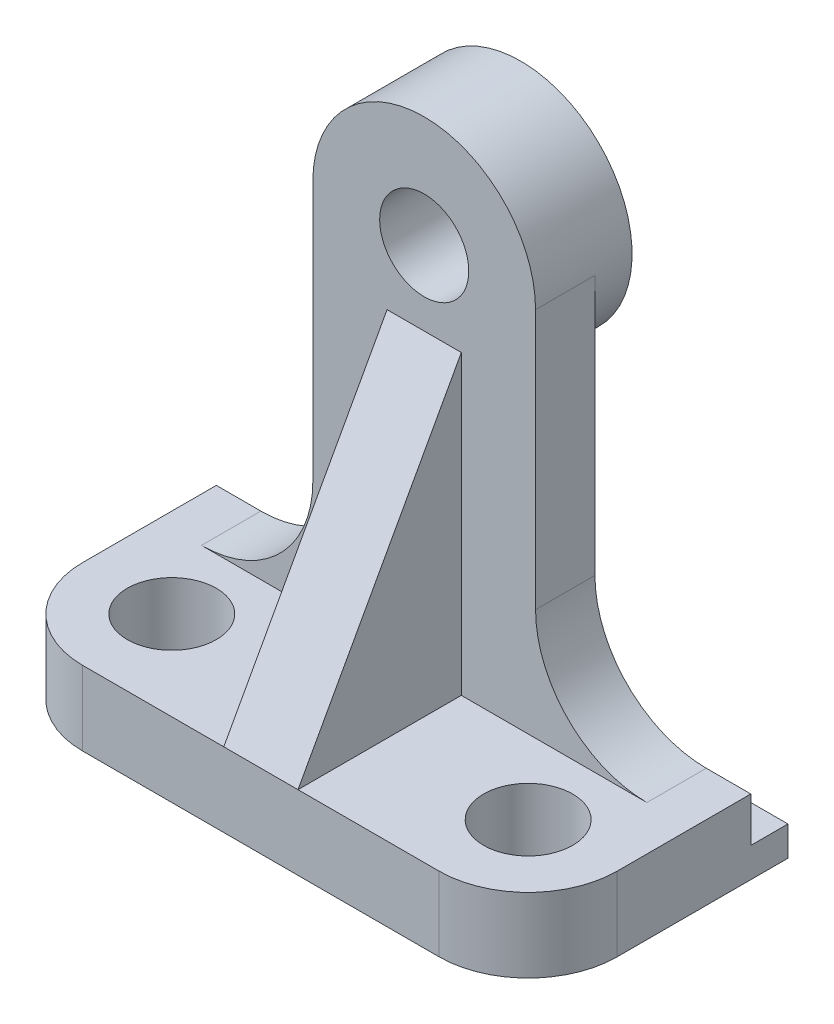
ISO-10303-21;
HEADER;
FILE_DESCRIPTION(('STEP AP214'),'2;1');
FILE_NAME('part.step','',(''),(''),'','','');
FILE_SCHEMA(('AUTOMOTIVE_DESIGN { 1 0 10303 214 1 1 1 1 }'));
ENDSEC;
DATA;
#1=APPLICATION_CONTEXT('core data for automotive mechanical design processes');
#2=APPLICATION_PROTOCOL_DEFINITION('international standard','automotive_design',2000,#1);
#3=PRODUCT_CONTEXT('',#1,'mechanical');
#4=PRODUCT('Part','Part','',(#3));
#5=PRODUCT_RELATED_PRODUCT_CATEGORY('part','',(#4));
#6=PRODUCT_DEFINITION_FORMATION('','',#4);
#7=PRODUCT_DEFINITION_CONTEXT('part definition',#1,'design');
#8=PRODUCT_DEFINITION('design','',#6,#7);
#9=PRODUCT_DEFINITION_SHAPE('','',#8);
#10=(LENGTH_UNIT() NAMED_UNIT(*) SI_UNIT(.MILLI.,.METRE.));
#11=(NAMED_UNIT(*) PLANE_ANGLE_UNIT() SI_UNIT($,.RADIAN.));
#12=(NAMED_UNIT(*) SI_UNIT($,.STERADIAN.) SOLID_ANGLE_UNIT());
#13=UNCERTAINTY_MEASURE_WITH_UNIT(LENGTH_MEASURE(1.E-05),#10,'distance_accuracy_value','');
#14=(GEOMETRIC_REPRESENTATION_CONTEXT(3) GLOBAL_UNCERTAINTY_ASSIGNED_CONTEXT((#13)) GLOBAL_UNIT_ASSIGNED_CONTEXT((#10,
#11,#12)) REPRESENTATION_CONTEXT('',''));
#15=CARTESIAN_POINT('',(0.,0.,0.));
#16=DIRECTION('',(0.,0.,1.));
#17=DIRECTION('',(1.,0.,0.));
#18=AXIS2_PLACEMENT_3D('',#15,#16,#17);
#19=CARTESIAN_POINT('',(0.,10.,0.));
#20=DIRECTION('',(0.,1.,0.));
#21=DIRECTION('',(0.,0.,1.));
#22=AXIS2_PLACEMENT_3D('',#19,#20,#21);
#23=PLANE('',#22);
#24=CARTESIAN_POINT('',(-24.,10.,5.5));
#25=DIRECTION('',(0.,1.,0.));
#26=DIRECTION('',(0.,0.,1.));
#27=AXIS2_PLACEMENT_3D('',#24,#25,#26);
#28=CIRCLE('',#27,6.);
#29=CARTESIAN_POINT('',(-24.,10.,11.5));
#30=VERTEX_POINT('',#29);
#31=EDGE_CURVE('E331',#30,#30,#28,.F.);
#32=ORIENTED_EDGE('',*,*,#31,.T.);
#33=EDGE_LOOP('',(#32));
#34=FACE_BOUND('',#33,.T.);
#35=DIRECTION('',(1.,0.,0.));
#36=VECTOR('',#35,1.);
#37=CARTESIAN_POINT('',(0.,10.,17.5));
#38=LINE('',#37,#36);
#39=CARTESIAN_POINT('',(-24.,10.,17.5));
#40=VERTEX_POINT('',#39);
#41=CARTESIAN_POINT('',(-5.,10.,17.5));
#42=VERTEX_POINT('',#41);
#43=EDGE_CURVE('E176',#40,#42,#38,.T.);
#44=ORIENTED_EDGE('',*,*,#43,.T.);
#45=DIRECTION('',(0.,0.,-1.));
#46=VECTOR('',#45,1.);
#47=CARTESIAN_POINT('',(-5.,10.,0.));
#48=LINE('',#47,#46);
#49=CARTESIAN_POINT('',(-5.,10.,-4.5));
#50=VERTEX_POINT('',#49);
#51=EDGE_CURVE('E155',#42,#50,#48,.T.);
#52=ORIENTED_EDGE('',*,*,#51,.T.);
#53=DIRECTION('',(1.,0.,0.));
#54=VECTOR('',#53,1.);
#55=CARTESIAN_POINT('',(-30.0000000000001,10.,-4.5));
#56=LINE('',#55,#54);
#57=CARTESIAN_POINT('',(-30.0000000000001,10.,-4.5));
#58=VERTEX_POINT('',#57);
#59=EDGE_CURVE('E61',#58,#50,#56,.T.);
#60=ORIENTED_EDGE('',*,*,#59,.F.);
#61=DIRECTION('',(0.,0.,-1.));
#62=VECTOR('',#61,1.);
#63=CARTESIAN_POINT('',(-30.0000000000001,10.,-4.5));
#64=LINE('',#63,#62);
#65=CARTESIAN_POINT('',(-30.,10.,-12.5));
#66=VERTEX_POINT('',#65);
#67=EDGE_CURVE('E322',#58,#66,#64,.T.);
#68=ORIENTED_EDGE('',*,*,#67,.T.);
#69=DIRECTION('',(-1.,0.,0.));
#70=VECTOR('',#69,1.);
#71=CARTESIAN_POINT('',(0.,10.,-12.5));
#72=LINE('',#71,#70);
#73=CARTESIAN_POINT('',(-36.,10.,-12.5));
#74=VERTEX_POINT('',#73);
#75=EDGE_CURVE('E335',#66,#74,#72,.T.);
#76=ORIENTED_EDGE('',*,*,#75,.T.);
#77=DIRECTION('',(0.,0.,1.));
#78=VECTOR('',#77,1.);
#79=CARTESIAN_POINT('',(-36.,10.,0.));
#80=LINE('',#79,#78);
#81=CARTESIAN_POINT('',(-36.,10.,5.49999999999992));
#82=VERTEX_POINT('',#81);
#83=EDGE_CURVE('E337',#74,#82,#80,.T.);
#84=ORIENTED_EDGE('',*,*,#83,.T.);
#85=CARTESIAN_POINT('',(-24.,10.,5.5));
#86=DIRECTION('',(0.,1.,0.));
#87=DIRECTION('',(0.,0.,1.));
#88=AXIS2_PLACEMENT_3D('',#85,#86,#87);
#89=CIRCLE('',#88,12.);
#90=EDGE_CURVE('E184',#82,#40,#89,.T.);
#91=ORIENTED_EDGE('',*,*,#90,.T.);
#92=EDGE_LOOP('',(#44,#52,#60,#68,#76,#84,#91));
#93=FACE_BOUND('',#92,.T.);
#94=ADVANCED_FACE('F38',(#34,#93),#23,.T.);
#95=CARTESIAN_POINT('',(0.,10.,-12.5));
#96=DIRECTION('',(0.,0.,1.));
#97=DIRECTION('',(1.,0.,0.));
#98=AXIS2_PLACEMENT_3D('',#95,#96,#97);
#99=PLANE('',#98);
#100=DIRECTION('',(-1.,0.,0.));
#101=VECTOR('',#100,1.);
#102=CARTESIAN_POINT('',(0.,4.,-12.5));
#103=LINE('',#102,#101);
#104=CARTESIAN_POINT('',(36.,4.,-12.5));
#105=VERTEX_POINT('',#104);
#106=CARTESIAN_POINT('',(-36.,4.,-12.5));
#107=VERTEX_POINT('',#106);
#108=EDGE_CURVE('E193',#105,#107,#103,.T.);
#109=ORIENTED_EDGE('',*,*,#108,.T.);
#110=DIRECTION('',(0.,-1.,0.));
#111=VECTOR('',#110,1.);
#112=CARTESIAN_POINT('',(-36.,10.,-12.5));
#113=LINE('',#112,#111);
#114=EDGE_CURVE('E188',#74,#107,#113,.T.);
#115=ORIENTED_EDGE('',*,*,#114,.F.);
#116=ORIENTED_EDGE('',*,*,#75,.F.);
#117=CARTESIAN_POINT('',(-30.,25.,-12.5));
#118=DIRECTION('',(0.,0.,-1.));
#119=DIRECTION('',(-1.,0.,0.));
#120=AXIS2_PLACEMENT_3D('',#117,#118,#119);
#121=CIRCLE('',#120,15.);
#122=CARTESIAN_POINT('',(-15.,25.0000000000001,-12.5));
#123=VERTEX_POINT('',#122);
#124=EDGE_CURVE('E307',#123,#66,#121,.T.);
#125=ORIENTED_EDGE('',*,*,#124,.F.);
#126=DIRECTION('',(0.,-1.,0.));
#127=VECTOR('',#126,1.);
#128=CARTESIAN_POINT('',(-15.,60.,-12.5));
#129=LINE('',#128,#127);
#130=CARTESIAN_POINT('',(-15.,60.,-12.5));
#131=VERTEX_POINT('',#130);
#132=EDGE_CURVE('E291',#131,#123,#129,.T.);
#133=ORIENTED_EDGE('',*,*,#132,.F.);
#134=CARTESIAN_POINT('',(0.,60.,-12.5));
#135=DIRECTION('',(0.,0.,-1.));
#136=DIRECTION('',(-1.,0.,0.));
#137=AXIS2_PLACEMENT_3D('',#134,#135,#136);
#138=CIRCLE('',#137,15.);
#139=CARTESIAN_POINT('',(15.,60.,-12.5));
#140=VERTEX_POINT('',#139);
#141=EDGE_CURVE('E179',#140,#131,#138,.T.);
#142=ORIENTED_EDGE('',*,*,#141,.F.);
#143=DIRECTION('',(0.,1.,0.));
#144=VECTOR('',#143,1.);
#145=CARTESIAN_POINT('',(15.,60.,-12.5));
#146=LINE('',#145,#144);
#147=CARTESIAN_POINT('',(15.,25.0000000000001,-12.5));
#148=VERTEX_POINT('',#147);
#149=EDGE_CURVE('E296',#148,#140,#146,.T.);
#150=ORIENTED_EDGE('',*,*,#149,.F.);
#151=CARTESIAN_POINT('',(30.,25.,-12.5));
#152=DIRECTION('',(0.,0.,-1.));
#153=DIRECTION('',(1.,0.,0.));
#154=AXIS2_PLACEMENT_3D('',#151,#152,#153);
#155=CIRCLE('',#154,15.);
#156=CARTESIAN_POINT('',(30.0000000000001,10.,-12.5));
#157=VERTEX_POINT('',#156);
#158=EDGE_CURVE('E310',#157,#148,#155,.T.);
#159=ORIENTED_EDGE('',*,*,#158,.F.);
#160=CARTESIAN_POINT('',(36.,10.,-12.5));
#161=VERTEX_POINT('',#160);
#162=EDGE_CURVE('E336',#161,#157,#72,.T.);
#163=ORIENTED_EDGE('',*,*,#162,.F.);
#164=DIRECTION('',(0.,-1.,0.));
#165=VECTOR('',#164,1.);
#166=CARTESIAN_POINT('',(36.,10.,-12.5));
#167=LINE('',#166,#165);
#168=EDGE_CURVE('E199',#161,#105,#167,.T.);
#169=ORIENTED_EDGE('',*,*,#168,.T.);
#170=EDGE_LOOP('',(#109,#115,#116,#125,#133,#142,#150,#159,#163,#169));
#171=FACE_BOUND('',#170,.T.);
#172=ADVANCED_FACE('F342',(#171),#99,.F.);
#173=DIRECTION('',(0.,0.,-1.));
#174=VECTOR('',#173,1.);
#175=CARTESIAN_POINT('',(5.,10.,0.));
#176=LINE('',#175,#174);
#177=CARTESIAN_POINT('',(5.,10.,17.5));
#178=VERTEX_POINT('',#177);
#179=CARTESIAN_POINT('',(5.,10.,-4.5));
#180=VERTEX_POINT('',#179);
#181=EDGE_CURVE('E270',#178,#180,#176,.T.);
#182=ORIENTED_EDGE('',*,*,#181,.F.);
#183=CARTESIAN_POINT('',(24.,10.,17.5));
#184=VERTEX_POINT('',#183);
#185=EDGE_CURVE('E178',#178,#184,#38,.T.);
#186=ORIENTED_EDGE('',*,*,#185,.T.);
#187=CARTESIAN_POINT('',(24.,10.,5.5));
#188=DIRECTION('',(0.,1.,0.));
#189=DIRECTION('',(0.,0.,1.));
#190=AXIS2_PLACEMENT_3D('',#187,#188,#189);
#191=CIRCLE('',#190,12.);
#192=CARTESIAN_POINT('',(36.,10.,5.49999999999992));
#193=VERTEX_POINT('',#192);
#194=EDGE_CURVE('E185',#184,#193,#191,.T.);
#195=ORIENTED_EDGE('',*,*,#194,.T.);
#196=DIRECTION('',(0.,0.,-1.));
#197=VECTOR('',#196,1.);
#198=CARTESIAN_POINT('',(36.,10.,0.));
#199=LINE('',#198,#197);
#200=EDGE_CURVE('E264',#193,#161,#199,.T.);
#201=ORIENTED_EDGE('',*,*,#200,.T.);
#202=ORIENTED_EDGE('',*,*,#162,.T.);
#203=DIRECTION('',(0.,0.,-1.));
#204=VECTOR('',#203,1.);
#205=CARTESIAN_POINT('',(30.0000000000001,10.,-4.5));
#206=LINE('',#205,#204);
#207=CARTESIAN_POINT('',(30.,10.,-4.5));
#208=VERTEX_POINT('',#207);
#209=EDGE_CURVE('E319',#208,#157,#206,.T.);
#210=ORIENTED_EDGE('',*,*,#209,.F.);
#211=EDGE_CURVE('E272',#180,#208,#56,.T.);
#212=ORIENTED_EDGE('',*,*,#211,.F.);
#213=EDGE_LOOP('',(#182,#186,#195,#201,#202,#210,#212));
#214=FACE_BOUND('',#213,.T.);
#215=CARTESIAN_POINT('',(24.,10.,5.5));
#216=DIRECTION('',(0.,1.,0.));
#217=DIRECTION('',(0.,0.,1.));
#218=AXIS2_PLACEMENT_3D('',#215,#216,#217);
#219=CIRCLE('',#218,6.);
#220=CARTESIAN_POINT('',(24.,10.,11.5));
#221=VERTEX_POINT('',#220);
#222=EDGE_CURVE('E195',#221,#221,#219,.F.);
#223=ORIENTED_EDGE('',*,*,#222,.T.);
#224=EDGE_LOOP('',(#223));
#225=FACE_BOUND('',#224,.T.);
#226=ADVANCED_FACE('F267',(#214,#225),#23,.T.);
#227=CARTESIAN_POINT('',(24.,4.,5.5));
#228=DIRECTION('',(0.,-1.,0.));
#229=DIRECTION('',(0.,0.,-1.));
#230=AXIS2_PLACEMENT_3D('',#227,#228,#229);
#231=PLANE('',#230);
#232=DIRECTION('',(-1.,0.,0.));
#233=VECTOR('',#232,1.);
#234=CARTESIAN_POINT('',(-36.,4.,-17.5));
#235=LINE('',#234,#233);
#236=CARTESIAN_POINT('',(36.,4.,-17.5));
#237=VERTEX_POINT('',#236);
#238=CARTESIAN_POINT('',(-36.,4.,-17.5));
#239=VERTEX_POINT('',#238);
#240=EDGE_CURVE('E211',#237,#239,#235,.T.);
#241=ORIENTED_EDGE('',*,*,#240,.T.);
#242=DIRECTION('',(0.,0.,1.));
#243=VECTOR('',#242,1.);
#244=CARTESIAN_POINT('',(-36.,4.,-17.5));
#245=LINE('',#244,#243);
#246=EDGE_CURVE('E214',#239,#107,#245,.T.);
#247=ORIENTED_EDGE('',*,*,#246,.T.);
#248=ORIENTED_EDGE('',*,*,#108,.F.);
#249=DIRECTION('',(0.,0.,-1.));
#250=VECTOR('',#249,1.);
#251=CARTESIAN_POINT('',(36.,4.,-17.5));
#252=LINE('',#251,#250);
#253=EDGE_CURVE('E209',#105,#237,#252,.T.);
#254=ORIENTED_EDGE('',*,*,#253,.T.);
#255=EDGE_LOOP('',(#241,#247,#248,#254));
#256=FACE_BOUND('',#255,.T.);
#257=ADVANCED_FACE('F345',(#256),#231,.F.);
#258=CARTESIAN_POINT('',(24.,0.,5.5));
#259=DIRECTION('',(0.,-1.,0.));
#260=DIRECTION('',(0.,0.,-1.));
#261=AXIS2_PLACEMENT_3D('',#258,#259,#260);
#262=PLANE('',#261);
#263=CARTESIAN_POINT('',(24.,0.,5.5));
#264=DIRECTION('',(0.,1.,0.));
#265=DIRECTION('',(0.,0.,-1.));
#266=AXIS2_PLACEMENT_3D('',#263,#264,#265);
#267=CIRCLE('',#266,12.);
#268=CARTESIAN_POINT('',(23.9999999999999,0.,17.5));
#269=VERTEX_POINT('',#268);
#270=CARTESIAN_POINT('',(36.,0.,5.49999999999992));
#271=VERTEX_POINT('',#270);
#272=EDGE_CURVE('E212',#269,#271,#267,.T.);
#273=ORIENTED_EDGE('',*,*,#272,.F.);
#274=DIRECTION('',(1.,0.,0.));
#275=VECTOR('',#274,1.);
#276=CARTESIAN_POINT('',(23.9999999999999,0.,17.5));
#277=LINE('',#276,#275);
#278=CARTESIAN_POINT('',(-24.,0.,17.5));
#279=VERTEX_POINT('',#278);
#280=EDGE_CURVE('E226',#279,#269,#277,.T.);
#281=ORIENTED_EDGE('',*,*,#280,.F.);
#282=CARTESIAN_POINT('',(-24.,0.,5.5));
#283=DIRECTION('',(0.,1.,0.));
#284=DIRECTION('',(0.,0.,1.));
#285=AXIS2_PLACEMENT_3D('',#282,#283,#284);
#286=CIRCLE('',#285,12.);
#287=CARTESIAN_POINT('',(-36.,0.,5.49999999999992));
#288=VERTEX_POINT('',#287);
#289=EDGE_CURVE('E224',#288,#279,#286,.T.);
#290=ORIENTED_EDGE('',*,*,#289,.F.);
#291=DIRECTION('',(0.,0.,1.));
#292=VECTOR('',#291,1.);
#293=CARTESIAN_POINT('',(-36.,0.,-17.5));
#294=LINE('',#293,#292);
#295=CARTESIAN_POINT('',(-36.,0.,-17.5));
#296=VERTEX_POINT('',#295);
#297=EDGE_CURVE('E222',#296,#288,#294,.T.);
#298=ORIENTED_EDGE('',*,*,#297,.F.);
#299=DIRECTION('',(-1.,0.,0.));
#300=VECTOR('',#299,1.);
#301=CARTESIAN_POINT('',(-36.,0.,-17.5));
#302=LINE('',#301,#300);
#303=CARTESIAN_POINT('',(36.,0.,-17.5));
#304=VERTEX_POINT('',#303);
#305=EDGE_CURVE('E220',#304,#296,#302,.T.);
#306=ORIENTED_EDGE('',*,*,#305,.F.);
#307=DIRECTION('',(0.,0.,-1.));
#308=VECTOR('',#307,1.);
#309=CARTESIAN_POINT('',(36.,0.,-17.5));
#310=LINE('',#309,#308);
#311=EDGE_CURVE('E208',#271,#304,#310,.T.);
#312=ORIENTED_EDGE('',*,*,#311,.F.);
#313=EDGE_LOOP('',(#273,#281,#290,#298,#306,#312));
#314=FACE_BOUND('',#313,.T.);
#315=CARTESIAN_POINT('',(24.,0.,5.5));
#316=DIRECTION('',(0.,1.,0.));
#317=DIRECTION('',(0.,0.,1.));
#318=AXIS2_PLACEMENT_3D('',#315,#316,#317);
#319=CIRCLE('',#318,6.);
#320=CARTESIAN_POINT('',(24.,0.,11.5));
#321=VERTEX_POINT('',#320);
#322=EDGE_CURVE('E205',#321,#321,#319,.T.);
#323=ORIENTED_EDGE('',*,*,#322,.T.);
#324=EDGE_LOOP('',(#323));
#325=FACE_BOUND('',#324,.T.);
#326=CARTESIAN_POINT('',(-24.,0.,5.5));
#327=DIRECTION('',(0.,1.,0.));
#328=DIRECTION('',(0.,0.,-1.));
#329=AXIS2_PLACEMENT_3D('',#326,#327,#328);
#330=CIRCLE('',#329,6.);
#331=CARTESIAN_POINT('',(-24.,0.,-0.5));
#332=VERTEX_POINT('',#331);
#333=EDGE_CURVE('E202',#332,#332,#330,.T.);
#334=ORIENTED_EDGE('',*,*,#333,.T.);
#335=EDGE_LOOP('',(#334));
#336=FACE_BOUND('',#335,.T.);
#337=ADVANCED_FACE('F249',(#314,#325,#336),#262,.T.);
#338=CARTESIAN_POINT('',(36.,4.,-17.5));
#339=DIRECTION('',(-1.,0.,0.));
#340=DIRECTION('',(0.,0.,1.));
#341=AXIS2_PLACEMENT_3D('',#338,#339,#340);
#342=PLANE('',#341);
#343=ORIENTED_EDGE('',*,*,#311,.T.);
#344=DIRECTION('',(0.,-1.,0.));
#345=VECTOR('',#344,1.);
#346=CARTESIAN_POINT('',(36.,4.,-17.5));
#347=LINE('',#346,#345);
#348=EDGE_CURVE('E11',#237,#304,#347,.T.);
#349=ORIENTED_EDGE('',*,*,#348,.F.);
#350=ORIENTED_EDGE('',*,*,#253,.F.);
#351=ORIENTED_EDGE('',*,*,#168,.F.);
#352=ORIENTED_EDGE('',*,*,#200,.F.);
#353=DIRECTION('',(0.,-1.,0.));
#354=VECTOR('',#353,1.);
#355=CARTESIAN_POINT('',(36.,4.,5.49999999999992));
#356=LINE('',#355,#354);
#357=EDGE_CURVE('E217',#193,#271,#356,.T.);
#358=ORIENTED_EDGE('',*,*,#357,.T.);
#359=EDGE_LOOP('',(#343,#349,#350,#351,#352,#358));
#360=FACE_BOUND('',#359,.T.);
#361=ADVANCED_FACE('F40',(#360),#342,.F.);
#362=CARTESIAN_POINT('',(-36.,4.,-17.5));
#363=DIRECTION('',(0.,0.,1.));
#364=DIRECTION('',(1.,0.,0.));
#365=AXIS2_PLACEMENT_3D('',#362,#363,#364);
#366=PLANE('',#365);
#367=ORIENTED_EDGE('',*,*,#305,.T.);
#368=DIRECTION('',(0.,-1.,0.));
#369=VECTOR('',#368,1.);
#370=CARTESIAN_POINT('',(-36.,4.,-17.5));
#371=LINE('',#370,#369);
#372=EDGE_CURVE('E46',#239,#296,#371,.T.);
#373=ORIENTED_EDGE('',*,*,#372,.F.);
#374=ORIENTED_EDGE('',*,*,#240,.F.);
#375=ORIENTED_EDGE('',*,*,#348,.T.);
#376=EDGE_LOOP('',(#367,#373,#374,#375));
#377=FACE_BOUND('',#376,.T.);
#378=ADVANCED_FACE('F346',(#377),#366,.F.);
#379=CARTESIAN_POINT('',(-36.,4.,-17.5));
#380=DIRECTION('',(1.,0.,0.));
#381=DIRECTION('',(0.,0.,-1.));
#382=AXIS2_PLACEMENT_3D('',#379,#380,#381);
#383=PLANE('',#382);
#384=ORIENTED_EDGE('',*,*,#297,.T.);
#385=DIRECTION('',(0.,-1.,0.));
#386=VECTOR('',#385,1.);
#387=CARTESIAN_POINT('',(-36.,4.,5.49999999999992));
#388=LINE('',#387,#386);
#389=EDGE_CURVE('E236',#82,#288,#388,.T.);
#390=ORIENTED_EDGE('',*,*,#389,.F.);
#391=ORIENTED_EDGE('',*,*,#83,.F.);
#392=ORIENTED_EDGE('',*,*,#114,.T.);
#393=ORIENTED_EDGE('',*,*,#246,.F.);
#394=ORIENTED_EDGE('',*,*,#372,.T.);
#395=EDGE_LOOP('',(#384,#390,#391,#392,#393,#394));
#396=FACE_BOUND('',#395,.T.);
#397=ADVANCED_FACE('F243',(#396),#383,.F.);
#398=CARTESIAN_POINT('',(-24.,4.,5.5));
#399=DIRECTION('',(0.,-1.,0.));
#400=DIRECTION('',(0.,0.,-1.));
#401=AXIS2_PLACEMENT_3D('',#398,#399,#400);
#402=CYLINDRICAL_SURFACE('',#401,12.);
#403=ORIENTED_EDGE('',*,*,#289,.T.);
#404=DIRECTION('',(0.,-1.,0.));
#405=VECTOR('',#404,1.);
#406=CARTESIAN_POINT('',(-24.,4.,17.5));
#407=LINE('',#406,#405);
#408=EDGE_CURVE('E234',#40,#279,#407,.T.);
#409=ORIENTED_EDGE('',*,*,#408,.F.);
#410=ORIENTED_EDGE('',*,*,#90,.F.);
#411=ORIENTED_EDGE('',*,*,#389,.T.);
#412=EDGE_LOOP('',(#403,#409,#410,#411));
#413=FACE_BOUND('',#412,.T.);
#414=ADVANCED_FACE('F254',(#413),#402,.T.);
#415=CARTESIAN_POINT('',(23.9999999999999,4.,17.5));
#416=DIRECTION('',(0.,0.,-1.));
#417=DIRECTION('',(-1.,0.,0.));
#418=AXIS2_PLACEMENT_3D('',#415,#416,#417);
#419=PLANE('',#418);
#420=ORIENTED_EDGE('',*,*,#185,.F.);
#421=DIRECTION('',(-1.,0.,0.));
#422=VECTOR('',#421,1.);
#423=CARTESIAN_POINT('',(23.9999999999999,10.,17.5));
#424=LINE('',#423,#422);
#425=EDGE_CURVE('E166',#42,#178,#424,.F.);
#426=ORIENTED_EDGE('',*,*,#425,.F.);
#427=ORIENTED_EDGE('',*,*,#43,.F.);
#428=ORIENTED_EDGE('',*,*,#408,.T.);
#429=ORIENTED_EDGE('',*,*,#280,.T.);
#430=DIRECTION('',(0.,-1.,0.));
#431=VECTOR('',#430,1.);
#432=CARTESIAN_POINT('',(23.9999999999999,4.,17.5));
#433=LINE('',#432,#431);
#434=EDGE_CURVE('E231',#184,#269,#433,.T.);
#435=ORIENTED_EDGE('',*,*,#434,.F.);
#436=EDGE_LOOP('',(#420,#426,#427,#428,#429,#435));
#437=FACE_BOUND('',#436,.T.);
#438=ADVANCED_FACE('F174',(#437),#419,.F.);
#439=CARTESIAN_POINT('',(24.,4.,5.5));
#440=DIRECTION('',(0.,-1.,0.));
#441=DIRECTION('',(0.,0.,-1.));
#442=AXIS2_PLACEMENT_3D('',#439,#440,#441);
#443=CYLINDRICAL_SURFACE('',#442,12.);
#444=ORIENTED_EDGE('',*,*,#272,.T.);
#445=ORIENTED_EDGE('',*,*,#357,.F.);
#446=ORIENTED_EDGE('',*,*,#194,.F.);
#447=ORIENTED_EDGE('',*,*,#434,.T.);
#448=EDGE_LOOP('',(#444,#445,#446,#447));
#449=FACE_BOUND('',#448,.T.);
#450=ADVANCED_FACE('F257',(#449),#443,.T.);
#451=CARTESIAN_POINT('',(24.,4.,5.5));
#452=DIRECTION('',(0.,-1.,0.));
#453=DIRECTION('',(0.,0.,-1.));
#454=AXIS2_PLACEMENT_3D('',#451,#452,#453);
#455=CYLINDRICAL_SURFACE('',#454,6.);
#456=ORIENTED_EDGE('',*,*,#322,.F.);
#457=EDGE_LOOP('',(#456));
#458=FACE_BOUND('',#457,.T.);
#459=ORIENTED_EDGE('',*,*,#222,.F.);
#460=EDGE_LOOP('',(#459));
#461=FACE_BOUND('',#460,.T.);
#462=ADVANCED_FACE('F371',(#458,#461),#455,.F.);
#463=CARTESIAN_POINT('',(-24.,4.,5.5));
#464=DIRECTION('',(0.,-1.,0.));
#465=DIRECTION('',(0.,0.,-1.));
#466=AXIS2_PLACEMENT_3D('',#463,#464,#465);
#467=CYLINDRICAL_SURFACE('',#466,6.);
#468=ORIENTED_EDGE('',*,*,#333,.F.);
#469=EDGE_LOOP('',(#468));
#470=FACE_BOUND('',#469,.T.);
#471=ORIENTED_EDGE('',*,*,#31,.F.);
#472=EDGE_LOOP('',(#471));
#473=FACE_BOUND('',#472,.T.);
#474=ADVANCED_FACE('F398',(#470,#473),#467,.F.);
#475=CARTESIAN_POINT('',(0.,60.,-4.5));
#476=DIRECTION('',(0.,0.,1.));
#477=DIRECTION('',(1.,0.,0.));
#478=AXIS2_PLACEMENT_3D('',#475,#476,#477);
#479=PLANE('',#478);
#480=DIRECTION('',(0.,1.,0.));
#481=VECTOR('',#480,1.);
#482=CARTESIAN_POINT('',(5.,60.,-4.5));
#483=LINE('',#482,#481);
#484=CARTESIAN_POINT('',(5.,50.,-4.5));
#485=VERTEX_POINT('',#484);
#486=EDGE_CURVE('E275',#180,#485,#483,.T.);
#487=ORIENTED_EDGE('',*,*,#486,.F.);
#488=ORIENTED_EDGE('',*,*,#211,.T.);
#489=CARTESIAN_POINT('',(30.,25.,-4.5));
#490=DIRECTION('',(0.,0.,-1.));
#491=DIRECTION('',(1.,0.,0.));
#492=AXIS2_PLACEMENT_3D('',#489,#490,#491);
#493=CIRCLE('',#492,15.);
#494=CARTESIAN_POINT('',(15.,25.0000000000001,-4.5));
#495=VERTEX_POINT('',#494);
#496=EDGE_CURVE('E301',#208,#495,#493,.T.);
#497=ORIENTED_EDGE('',*,*,#496,.T.);
#498=DIRECTION('',(0.,1.,0.));
#499=VECTOR('',#498,1.);
#500=CARTESIAN_POINT('',(15.,60.,-4.5));
#501=LINE('',#500,#499);
#502=CARTESIAN_POINT('',(15.,60.,-4.5));
#503=VERTEX_POINT('',#502);
#504=EDGE_CURVE('E303',#495,#503,#501,.T.);
#505=ORIENTED_EDGE('',*,*,#504,.T.);
#506=CARTESIAN_POINT('',(0.,60.,-4.5));
#507=DIRECTION('',(0.,0.,1.));
#508=DIRECTION('',(1.,0.,0.));
#509=AXIS2_PLACEMENT_3D('',#506,#507,#508);
#510=CIRCLE('',#509,15.);
#511=CARTESIAN_POINT('',(-15.,60.,-4.5));
#512=VERTEX_POINT('',#511);
#513=EDGE_CURVE('E292',#503,#512,#510,.T.);
#514=ORIENTED_EDGE('',*,*,#513,.T.);
#515=DIRECTION('',(0.,-1.,0.));
#516=VECTOR('',#515,1.);
#517=CARTESIAN_POINT('',(-15.,60.,-4.5));
#518=LINE('',#517,#516);
#519=CARTESIAN_POINT('',(-15.,25.0000000000001,-4.5));
#520=VERTEX_POINT('',#519);
#521=EDGE_CURVE('E295',#512,#520,#518,.T.);
#522=ORIENTED_EDGE('',*,*,#521,.T.);
#523=CARTESIAN_POINT('',(-30.,25.,-4.5));
#524=DIRECTION('',(0.,0.,-1.));
#525=DIRECTION('',(-1.,0.,0.));
#526=AXIS2_PLACEMENT_3D('',#523,#524,#525);
#527=CIRCLE('',#526,15.);
#528=EDGE_CURVE('E298',#520,#58,#527,.T.);
#529=ORIENTED_EDGE('',*,*,#528,.T.);
#530=ORIENTED_EDGE('',*,*,#59,.T.);
#531=DIRECTION('',(0.,1.,0.));
#532=VECTOR('',#531,1.);
#533=CARTESIAN_POINT('',(-5.,60.,-4.5));
#534=LINE('',#533,#532);
#535=CARTESIAN_POINT('',(-5.,50.,-4.5));
#536=VERTEX_POINT('',#535);
#537=EDGE_CURVE('E158',#50,#536,#534,.T.);
#538=ORIENTED_EDGE('',*,*,#537,.T.);
#539=DIRECTION('',(1.,0.,0.));
#540=VECTOR('',#539,1.);
#541=CARTESIAN_POINT('',(0.,50.,-4.5));
#542=LINE('',#541,#540);
#543=EDGE_CURVE('E169',#485,#536,#542,.F.);
#544=ORIENTED_EDGE('',*,*,#543,.F.);
#545=EDGE_LOOP('',(#487,#488,#497,#505,#514,#522,#529,#530,#538,#544));
#546=FACE_BOUND('',#545,.T.);
#547=CARTESIAN_POINT('',(0.,60.,-4.5));
#548=DIRECTION('',(0.,0.,1.));
#549=DIRECTION('',(1.,0.,0.));
#550=AXIS2_PLACEMENT_3D('',#547,#548,#549);
#551=CIRCLE('',#550,6.);
#552=CARTESIAN_POINT('',(6.,60.,-4.5));
#553=VERTEX_POINT('',#552);
#554=EDGE_CURVE('E287',#553,#553,#551,.T.);
#555=ORIENTED_EDGE('',*,*,#554,.F.);
#556=EDGE_LOOP('',(#555));
#557=FACE_BOUND('',#556,.T.);
#558=ADVANCED_FACE('F405',(#546,#557),#479,.T.);
#559=CARTESIAN_POINT('',(0.,60.,-4.5));
#560=DIRECTION('',(0.,0.,-1.));
#561=DIRECTION('',(-1.,0.,0.));
#562=AXIS2_PLACEMENT_3D('',#559,#560,#561);
#563=CYLINDRICAL_SURFACE('',#562,15.);
#564=CARTESIAN_POINT('',(0.,60.,-17.5));
#565=DIRECTION('',(0.,0.,-1.));
#566=DIRECTION('',(-1.,0.,0.));
#567=AXIS2_PLACEMENT_3D('',#564,#565,#566);
#568=CIRCLE('',#567,15.);
#569=CARTESIAN_POINT('',(-15.,60.,-17.5));
#570=VERTEX_POINT('',#569);
#571=EDGE_CURVE('E284',#570,#570,#568,.T.);
#572=ORIENTED_EDGE('',*,*,#571,.F.);
#573=EDGE_LOOP('',(#572));
#574=FACE_BOUND('',#573,.T.);
#575=ORIENTED_EDGE('',*,*,#141,.T.);
#576=DIRECTION('',(0.,0.,-1.));
#577=VECTOR('',#576,1.);
#578=CARTESIAN_POINT('',(-15.,60.,-4.5));
#579=LINE('',#578,#577);
#580=EDGE_CURVE('E196',#512,#131,#579,.T.);
#581=ORIENTED_EDGE('',*,*,#580,.F.);
#582=ORIENTED_EDGE('',*,*,#513,.F.);
#583=DIRECTION('',(0.,0.,-1.));
#584=VECTOR('',#583,1.);
#585=CARTESIAN_POINT('',(15.,60.,-4.5));
#586=LINE('',#585,#584);
#587=EDGE_CURVE('E305',#503,#140,#586,.T.);
#588=ORIENTED_EDGE('',*,*,#587,.T.);
#589=EDGE_LOOP('',(#575,#581,#582,#588));
#590=FACE_BOUND('',#589,.T.);
#591=ADVANCED_FACE('F412',(#574,#590),#563,.T.);
#592=CARTESIAN_POINT('',(-15.,60.,-4.5));
#593=DIRECTION('',(1.,0.,0.));
#594=DIRECTION('',(0.,0.,-1.));
#595=AXIS2_PLACEMENT_3D('',#592,#593,#594);
#596=PLANE('',#595);
#597=ORIENTED_EDGE('',*,*,#132,.T.);
#598=DIRECTION('',(0.,0.,-1.));
#599=VECTOR('',#598,1.);
#600=CARTESIAN_POINT('',(-15.,25.0000000000001,-4.5));
#601=LINE('',#600,#599);
#602=EDGE_CURVE('E324',#520,#123,#601,.T.);
#603=ORIENTED_EDGE('',*,*,#602,.F.);
#604=ORIENTED_EDGE('',*,*,#521,.F.);
#605=ORIENTED_EDGE('',*,*,#580,.T.);
#606=EDGE_LOOP('',(#597,#603,#604,#605));
#607=FACE_BOUND('',#606,.T.);
#608=ADVANCED_FACE('F420',(#607),#596,.F.);
#609=CARTESIAN_POINT('',(-30.,25.,-4.5));
#610=DIRECTION('',(0.,0.,-1.));
#611=DIRECTION('',(-1.,0.,0.));
#612=AXIS2_PLACEMENT_3D('',#609,#610,#611);
#613=CYLINDRICAL_SURFACE('',#612,15.);
#614=ORIENTED_EDGE('',*,*,#124,.T.);
#615=ORIENTED_EDGE('',*,*,#67,.F.);
#616=ORIENTED_EDGE('',*,*,#528,.F.);
#617=ORIENTED_EDGE('',*,*,#602,.T.);
#618=EDGE_LOOP('',(#614,#615,#616,#617));
#619=FACE_BOUND('',#618,.T.);
#620=ADVANCED_FACE('F428',(#619),#613,.F.);
#621=CARTESIAN_POINT('',(30.,25.,-4.5));
#622=DIRECTION('',(0.,0.,-1.));
#623=DIRECTION('',(-1.,0.,0.));
#624=AXIS2_PLACEMENT_3D('',#621,#622,#623);
#625=CYLINDRICAL_SURFACE('',#624,15.);
#626=ORIENTED_EDGE('',*,*,#158,.T.);
#627=DIRECTION('',(0.,0.,-1.));
#628=VECTOR('',#627,1.);
#629=CARTESIAN_POINT('',(15.,25.0000000000001,-4.5));
#630=LINE('',#629,#628);
#631=EDGE_CURVE('E316',#495,#148,#630,.T.);
#632=ORIENTED_EDGE('',*,*,#631,.F.);
#633=ORIENTED_EDGE('',*,*,#496,.F.);
#634=ORIENTED_EDGE('',*,*,#209,.T.);
#635=EDGE_LOOP('',(#626,#632,#633,#634));
#636=FACE_BOUND('',#635,.T.);
#637=ADVANCED_FACE('F437',(#636),#625,.F.);
#638=CARTESIAN_POINT('',(15.,60.,-4.5));
#639=DIRECTION('',(-1.,0.,0.));
#640=DIRECTION('',(0.,0.,1.));
#641=AXIS2_PLACEMENT_3D('',#638,#639,#640);
#642=PLANE('',#641);
#643=ORIENTED_EDGE('',*,*,#149,.T.);
#644=ORIENTED_EDGE('',*,*,#587,.F.);
#645=ORIENTED_EDGE('',*,*,#504,.F.);
#646=ORIENTED_EDGE('',*,*,#631,.T.);
#647=EDGE_LOOP('',(#643,#644,#645,#646));
#648=FACE_BOUND('',#647,.T.);
#649=ADVANCED_FACE('F444',(#648),#642,.F.);
#650=CARTESIAN_POINT('',(0.,60.,-4.5));
#651=DIRECTION('',(0.,0.,-1.));
#652=DIRECTION('',(-1.,0.,0.));
#653=AXIS2_PLACEMENT_3D('',#650,#651,#652);
#654=CYLINDRICAL_SURFACE('',#653,6.);
#655=CARTESIAN_POINT('',(0.,60.,-17.5));
#656=DIRECTION('',(0.,0.,-1.));
#657=DIRECTION('',(-1.,0.,0.));
#658=AXIS2_PLACEMENT_3D('',#655,#656,#657);
#659=CIRCLE('',#658,6.);
#660=CARTESIAN_POINT('',(-6.,60.,-17.5));
#661=VERTEX_POINT('',#660);
#662=EDGE_CURVE('E281',#661,#661,#659,.F.);
#663=ORIENTED_EDGE('',*,*,#662,.F.);
#664=EDGE_LOOP('',(#663));
#665=FACE_BOUND('',#664,.T.);
#666=ORIENTED_EDGE('',*,*,#554,.T.);
#667=EDGE_LOOP('',(#666));
#668=FACE_BOUND('',#667,.T.);
#669=ADVANCED_FACE('F451',(#665,#668),#654,.F.);
#670=CARTESIAN_POINT('',(0.,0.,-17.5));
#671=DIRECTION('',(0.,0.,-1.));
#672=DIRECTION('',(-1.,0.,0.));
#673=AXIS2_PLACEMENT_3D('',#670,#671,#672);
#674=PLANE('',#673);
#675=ORIENTED_EDGE('',*,*,#662,.T.);
#676=EDGE_LOOP('',(#675));
#677=FACE_BOUND('',#676,.T.);
#678=ORIENTED_EDGE('',*,*,#571,.T.);
#679=EDGE_LOOP('',(#678));
#680=FACE_BOUND('',#679,.T.);
#681=ADVANCED_FACE('F458',(#677,#680),#674,.T.);
#682=CARTESIAN_POINT('',(0.,10.,17.5));
#683=DIRECTION('',(0.,-0.481918749772156,-0.876215908676647));
#684=DIRECTION('',(0.,0.876215908676647,-0.481918749772156));
#685=AXIS2_PLACEMENT_3D('',#682,#683,#684);
#686=PLANE('',#685);
#687=DIRECTION('',(0.,0.876215908676647,-0.481918749772156));
#688=VECTOR('',#687,1.);
#689=CARTESIAN_POINT('',(-5.,10.,17.5));
#690=LINE('',#689,#688);
#691=EDGE_CURVE('E53',#42,#536,#690,.T.);
#692=ORIENTED_EDGE('',*,*,#691,.F.);
#693=ORIENTED_EDGE('',*,*,#425,.T.);
#694=DIRECTION('',(0.,0.876215908676647,-0.481918749772156));
#695=VECTOR('',#694,1.);
#696=CARTESIAN_POINT('',(5.,10.,17.5));
#697=LINE('',#696,#695);
#698=EDGE_CURVE('E160',#178,#485,#697,.T.);
#699=ORIENTED_EDGE('',*,*,#698,.T.);
#700=ORIENTED_EDGE('',*,*,#543,.T.);
#701=EDGE_LOOP('',(#692,#693,#699,#700));
#702=FACE_BOUND('',#701,.T.);
#703=ADVANCED_FACE('F164',(#702),#686,.F.);
#704=CARTESIAN_POINT('',(5.,37.5,0.));
#705=DIRECTION('',(1.,0.,0.));
#706=DIRECTION('',(0.,0.,-1.));
#707=AXIS2_PLACEMENT_3D('',#704,#705,#706);
#708=PLANE('',#707);
#709=ORIENTED_EDGE('',*,*,#181,.T.);
#710=ORIENTED_EDGE('',*,*,#486,.T.);
#711=ORIENTED_EDGE('',*,*,#698,.F.);
#712=EDGE_LOOP('',(#709,#710,#711));
#713=FACE_BOUND('',#712,.T.);
#714=ADVANCED_FACE('F473',(#713),#708,.T.);
#715=CARTESIAN_POINT('',(-5.,37.5,0.));
#716=DIRECTION('',(1.,0.,0.));
#717=DIRECTION('',(0.,0.,-1.));
#718=AXIS2_PLACEMENT_3D('',#715,#716,#717);
#719=PLANE('',#718);
#720=ORIENTED_EDGE('',*,*,#537,.F.);
#721=ORIENTED_EDGE('',*,*,#51,.F.);
#722=ORIENTED_EDGE('',*,*,#691,.T.);
#723=EDGE_LOOP('',(#720,#721,#722));
#724=FACE_BOUND('',#723,.T.);
#725=ADVANCED_FACE('F156',(#724),#719,.F.);
#726=CLOSED_SHELL('',(#94,#172,#226,#257,#337,#361,#378,#397,#414,#438,#450,#462,#474,#558,#591,
#608,#620,#637,#649,#669,#681,#703,#714,#725));
#727=MANIFOLD_SOLID_BREP('B2',#726);
#728=ADVANCED_BREP_SHAPE_REPRESENTATION('',(#18,#727),#14);
#729=SHAPE_DEFINITION_REPRESENTATION(#9,#728);
ENDSEC;
END-ISO-10303-21;
